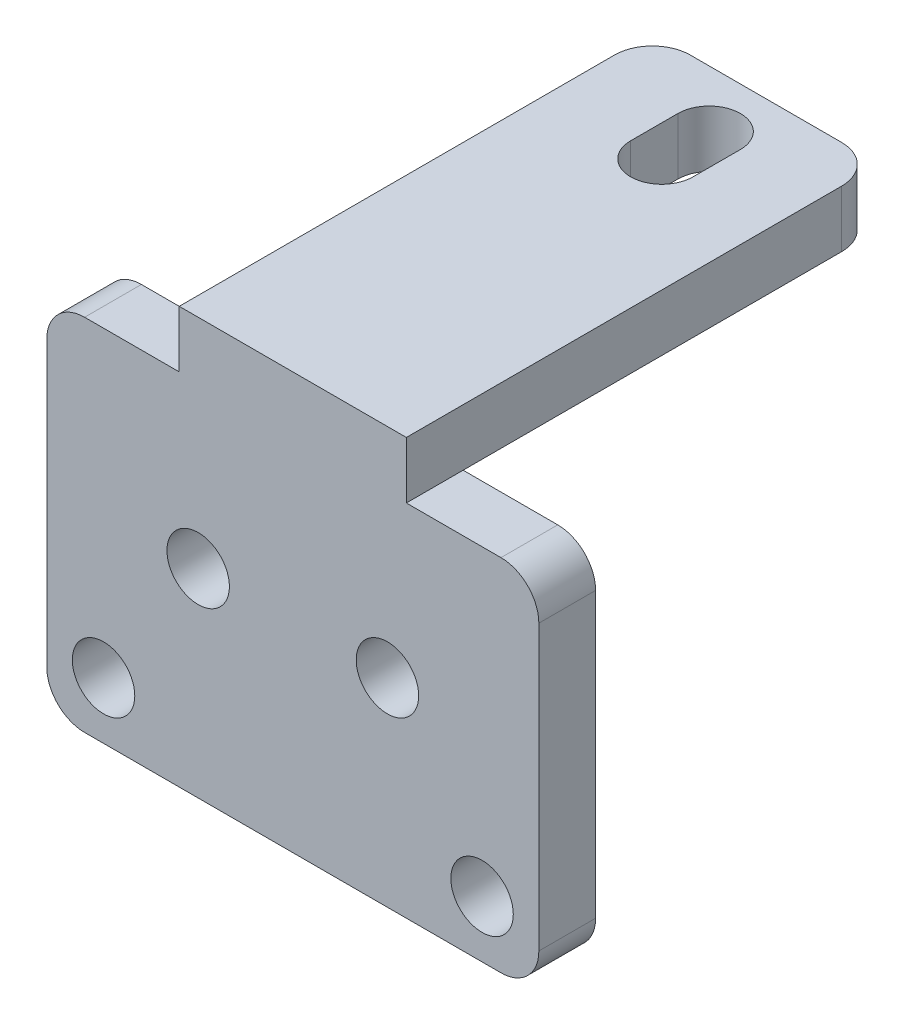
ISO-10303-21;
HEADER;
FILE_DESCRIPTION(('STEP AP214'),'2;1');
FILE_NAME('part.step','',(''),(''),'','','');
FILE_SCHEMA(('AUTOMOTIVE_DESIGN { 1 0 10303 214 1 1 1 1 }'));
ENDSEC;
DATA;
#1=APPLICATION_CONTEXT('core data for automotive mechanical design processes');
#2=APPLICATION_PROTOCOL_DEFINITION('international standard','automotive_design',2000,#1);
#3=PRODUCT_CONTEXT('',#1,'mechanical');
#4=PRODUCT('Part','Part','',(#3));
#5=PRODUCT_RELATED_PRODUCT_CATEGORY('part','',(#4));
#6=PRODUCT_DEFINITION_FORMATION('','',#4);
#7=PRODUCT_DEFINITION_CONTEXT('part definition',#1,'design');
#8=PRODUCT_DEFINITION('design','',#6,#7);
#9=PRODUCT_DEFINITION_SHAPE('','',#8);
#10=(LENGTH_UNIT() NAMED_UNIT(*) SI_UNIT(.MILLI.,.METRE.));
#11=(NAMED_UNIT(*) PLANE_ANGLE_UNIT() SI_UNIT($,.RADIAN.));
#12=(NAMED_UNIT(*) SI_UNIT($,.STERADIAN.) SOLID_ANGLE_UNIT());
#13=UNCERTAINTY_MEASURE_WITH_UNIT(LENGTH_MEASURE(1.E-05),#10,'distance_accuracy_value','');
#14=(GEOMETRIC_REPRESENTATION_CONTEXT(3) GLOBAL_UNCERTAINTY_ASSIGNED_CONTEXT((#13)) GLOBAL_UNIT_ASSIGNED_CONTEXT((#10,
#11,#12)) REPRESENTATION_CONTEXT('',''));
#15=CARTESIAN_POINT('',(0.,0.,0.));
#16=DIRECTION('',(0.,0.,1.));
#17=DIRECTION('',(1.,0.,0.));
#18=AXIS2_PLACEMENT_3D('',#15,#16,#17);
#19=CARTESIAN_POINT('',(0.,19.,3.));
#20=DIRECTION('',(0.,1.,0.));
#21=DIRECTION('',(0.,0.,1.));
#22=AXIS2_PLACEMENT_3D('',#19,#20,#21);
#23=PLANE('',#22);
#24=DIRECTION('',(0.,0.,-1.));
#25=VECTOR('',#24,1.);
#26=CARTESIAN_POINT('',(6.,19.,3.));
#27=LINE('',#26,#25);
#28=CARTESIAN_POINT('',(6.,19.,3.));
#29=VERTEX_POINT('',#28);
#30=CARTESIAN_POINT('',(6.,19.,-20.));
#31=VERTEX_POINT('',#30);
#32=EDGE_CURVE('E269',#29,#31,#27,.T.);
#33=ORIENTED_EDGE('',*,*,#32,.T.);
#34=CARTESIAN_POINT('',(4.,19.,-20.));
#35=DIRECTION('',(0.,1.,0.));
#36=DIRECTION('',(0.,0.,1.));
#37=AXIS2_PLACEMENT_3D('',#34,#35,#36);
#38=CIRCLE('',#37,2.);
#39=CARTESIAN_POINT('',(4.,19.,-22.));
#40=VERTEX_POINT('',#39);
#41=EDGE_CURVE('E298',#31,#40,#38,.T.);
#42=ORIENTED_EDGE('',*,*,#41,.T.);
#43=DIRECTION('',(1.,0.,0.));
#44=VECTOR('',#43,1.);
#45=CARTESIAN_POINT('',(0.,19.,-22.));
#46=LINE('',#45,#44);
#47=CARTESIAN_POINT('',(-4.,19.,-22.));
#48=VERTEX_POINT('',#47);
#49=EDGE_CURVE('E202',#48,#40,#46,.T.);
#50=ORIENTED_EDGE('',*,*,#49,.F.);
#51=CARTESIAN_POINT('',(-4.,19.,-20.));
#52=DIRECTION('',(0.,1.,0.));
#53=DIRECTION('',(0.,0.,1.));
#54=AXIS2_PLACEMENT_3D('',#51,#52,#53);
#55=CIRCLE('',#54,2.);
#56=CARTESIAN_POINT('',(-6.,19.,-20.));
#57=VERTEX_POINT('',#56);
#58=EDGE_CURVE('E296',#48,#57,#55,.T.);
#59=ORIENTED_EDGE('',*,*,#58,.T.);
#60=DIRECTION('',(0.,0.,-1.));
#61=VECTOR('',#60,1.);
#62=CARTESIAN_POINT('',(-6.,19.,3.));
#63=LINE('',#62,#61);
#64=CARTESIAN_POINT('',(-6.,19.,3.));
#65=VERTEX_POINT('',#64);
#66=EDGE_CURVE('E266',#65,#57,#63,.T.);
#67=ORIENTED_EDGE('',*,*,#66,.F.);
#68=DIRECTION('',(1.,0.,0.));
#69=VECTOR('',#68,1.);
#70=CARTESIAN_POINT('',(0.,19.,3.));
#71=LINE('',#70,#69);
#72=EDGE_CURVE('E232',#65,#29,#71,.T.);
#73=ORIENTED_EDGE('',*,*,#72,.T.);
#74=EDGE_LOOP('',(#33,#42,#50,#59,#67,#73));
#75=FACE_BOUND('',#74,.T.);
#76=DIRECTION('',(0.,0.,1.));
#77=VECTOR('',#76,1.);
#78=CARTESIAN_POINT('',(-1.65,19.,3.));
#79=LINE('',#78,#77);
#80=CARTESIAN_POINT('',(-1.65,19.,-19.));
#81=VERTEX_POINT('',#80);
#82=CARTESIAN_POINT('',(-1.65,19.,-16.5));
#83=VERTEX_POINT('',#82);
#84=EDGE_CURVE('E184',#81,#83,#79,.T.);
#85=ORIENTED_EDGE('',*,*,#84,.F.);
#86=CARTESIAN_POINT('',(0.,19.,-19.));
#87=DIRECTION('',(0.,1.,0.));
#88=DIRECTION('',(0.,0.,1.));
#89=AXIS2_PLACEMENT_3D('',#86,#87,#88);
#90=CIRCLE('',#89,1.65);
#91=CARTESIAN_POINT('',(1.65,19.,-19.));
#92=VERTEX_POINT('',#91);
#93=EDGE_CURVE('E167',#81,#92,#90,.F.);
#94=ORIENTED_EDGE('',*,*,#93,.T.);
#95=DIRECTION('',(0.,0.,1.));
#96=VECTOR('',#95,1.);
#97=CARTESIAN_POINT('',(1.65,19.,3.));
#98=LINE('',#97,#96);
#99=CARTESIAN_POINT('',(1.65,19.,-16.5));
#100=VERTEX_POINT('',#99);
#101=EDGE_CURVE('E178',#92,#100,#98,.T.);
#102=ORIENTED_EDGE('',*,*,#101,.T.);
#103=CARTESIAN_POINT('',(0.,19.,-16.5));
#104=DIRECTION('',(0.,1.,0.));
#105=DIRECTION('',(0.,0.,1.));
#106=AXIS2_PLACEMENT_3D('',#103,#104,#105);
#107=CIRCLE('',#106,1.65);
#108=EDGE_CURVE('E191',#100,#83,#107,.F.);
#109=ORIENTED_EDGE('',*,*,#108,.T.);
#110=EDGE_LOOP('',(#85,#94,#102,#109));
#111=FACE_BOUND('',#110,.T.);
#112=ADVANCED_FACE('F37',(#75,#111),#23,.T.);
#113=CARTESIAN_POINT('',(0.,16.,-22.));
#114=DIRECTION('',(0.,-1.,0.));
#115=DIRECTION('',(1.,0.,0.));
#116=AXIS2_PLACEMENT_3D('',#113,#114,#115);
#117=PLANE('',#116);
#118=DIRECTION('',(1.,0.,0.));
#119=VECTOR('',#118,1.);
#120=CARTESIAN_POINT('',(0.,16.,-22.));
#121=LINE('',#120,#119);
#122=CARTESIAN_POINT('',(-4.,16.,-22.));
#123=VERTEX_POINT('',#122);
#124=CARTESIAN_POINT('',(4.,16.,-22.));
#125=VERTEX_POINT('',#124);
#126=EDGE_CURVE('E195',#123,#125,#121,.T.);
#127=ORIENTED_EDGE('',*,*,#126,.T.);
#128=CARTESIAN_POINT('',(4.,16.,-20.));
#129=DIRECTION('',(0.,-1.,0.));
#130=DIRECTION('',(1.,0.,0.));
#131=AXIS2_PLACEMENT_3D('',#128,#129,#130);
#132=CIRCLE('',#131,2.);
#133=CARTESIAN_POINT('',(6.,16.,-20.));
#134=VERTEX_POINT('',#133);
#135=EDGE_CURVE('E292',#125,#134,#132,.T.);
#136=ORIENTED_EDGE('',*,*,#135,.T.);
#137=DIRECTION('',(0.,0.,1.));
#138=VECTOR('',#137,1.);
#139=CARTESIAN_POINT('',(6.,16.,-22.));
#140=LINE('',#139,#138);
#141=CARTESIAN_POINT('',(6.,16.,0.));
#142=VERTEX_POINT('',#141);
#143=EDGE_CURVE('E204',#134,#142,#140,.T.);
#144=ORIENTED_EDGE('',*,*,#143,.T.);
#145=DIRECTION('',(1.,0.,0.));
#146=VECTOR('',#145,1.);
#147=CARTESIAN_POINT('',(0.,16.,0.));
#148=LINE('',#147,#146);
#149=CARTESIAN_POINT('',(-6.,16.,0.));
#150=VERTEX_POINT('',#149);
#151=EDGE_CURVE('E192',#150,#142,#148,.T.);
#152=ORIENTED_EDGE('',*,*,#151,.F.);
#153=DIRECTION('',(0.,0.,1.));
#154=VECTOR('',#153,1.);
#155=CARTESIAN_POINT('',(-6.,16.,-22.));
#156=LINE('',#155,#154);
#157=CARTESIAN_POINT('',(-6.,16.,-20.));
#158=VERTEX_POINT('',#157);
#159=EDGE_CURVE('E208',#158,#150,#156,.T.);
#160=ORIENTED_EDGE('',*,*,#159,.F.);
#161=CARTESIAN_POINT('',(-4.,16.,-20.));
#162=DIRECTION('',(0.,-1.,0.));
#163=DIRECTION('',(1.,0.,0.));
#164=AXIS2_PLACEMENT_3D('',#161,#162,#163);
#165=CIRCLE('',#164,2.);
#166=EDGE_CURVE('E290',#158,#123,#165,.T.);
#167=ORIENTED_EDGE('',*,*,#166,.T.);
#168=EDGE_LOOP('',(#127,#136,#144,#152,#160,#167));
#169=FACE_BOUND('',#168,.T.);
#170=DIRECTION('',(0.,0.,-1.));
#171=VECTOR('',#170,1.);
#172=CARTESIAN_POINT('',(-1.65,16.,-22.));
#173=LINE('',#172,#171);
#174=CARTESIAN_POINT('',(-1.65,16.,-16.5));
#175=VERTEX_POINT('',#174);
#176=CARTESIAN_POINT('',(-1.65,16.,-19.));
#177=VERTEX_POINT('',#176);
#178=EDGE_CURVE('E187',#175,#177,#173,.T.);
#179=ORIENTED_EDGE('',*,*,#178,.F.);
#180=CARTESIAN_POINT('',(0.,16.,-16.5));
#181=DIRECTION('',(0.,-1.,0.));
#182=DIRECTION('',(1.,0.,0.));
#183=AXIS2_PLACEMENT_3D('',#180,#181,#182);
#184=CIRCLE('',#183,1.65);
#185=CARTESIAN_POINT('',(1.65,16.,-16.5));
#186=VERTEX_POINT('',#185);
#187=EDGE_CURVE('E280',#175,#186,#184,.F.);
#188=ORIENTED_EDGE('',*,*,#187,.T.);
#189=DIRECTION('',(0.,0.,-1.));
#190=VECTOR('',#189,1.);
#191=CARTESIAN_POINT('',(1.65,16.,-22.));
#192=LINE('',#191,#190);
#193=CARTESIAN_POINT('',(1.65,16.,-19.));
#194=VERTEX_POINT('',#193);
#195=EDGE_CURVE('E277',#186,#194,#192,.T.);
#196=ORIENTED_EDGE('',*,*,#195,.T.);
#197=CARTESIAN_POINT('',(0.,16.,-19.));
#198=DIRECTION('',(0.,-1.,0.));
#199=DIRECTION('',(1.,0.,0.));
#200=AXIS2_PLACEMENT_3D('',#197,#198,#199);
#201=CIRCLE('',#200,1.65);
#202=EDGE_CURVE('E275',#194,#177,#201,.F.);
#203=ORIENTED_EDGE('',*,*,#202,.T.);
#204=EDGE_LOOP('',(#179,#188,#196,#203));
#205=FACE_BOUND('',#204,.T.);
#206=ADVANCED_FACE('F393',(#169,#205),#117,.T.);
#207=CARTESIAN_POINT('',(13.,0.,3.));
#208=DIRECTION('',(1.,0.,0.));
#209=DIRECTION('',(0.,1.,0.));
#210=AXIS2_PLACEMENT_3D('',#207,#208,#209);
#211=PLANE('',#210);
#212=DIRECTION('',(0.,-1.,0.));
#213=VECTOR('',#212,1.);
#214=CARTESIAN_POINT('',(13.,0.,0.));
#215=LINE('',#214,#213);
#216=CARTESIAN_POINT('',(13.,14.,0.));
#217=VERTEX_POINT('',#216);
#218=CARTESIAN_POINT('',(13.,-0.999999999999985,0.));
#219=VERTEX_POINT('',#218);
#220=EDGE_CURVE('E254',#217,#219,#215,.T.);
#221=ORIENTED_EDGE('',*,*,#220,.F.);
#222=DIRECTION('',(0.,0.,-1.));
#223=VECTOR('',#222,1.);
#224=CARTESIAN_POINT('',(13.,14.,3.));
#225=LINE('',#224,#223);
#226=CARTESIAN_POINT('',(13.,14.,3.));
#227=VERTEX_POINT('',#226);
#228=EDGE_CURVE('E330',#217,#227,#225,.F.);
#229=ORIENTED_EDGE('',*,*,#228,.T.);
#230=DIRECTION('',(0.,-1.,0.));
#231=VECTOR('',#230,1.);
#232=CARTESIAN_POINT('',(13.,0.,3.));
#233=LINE('',#232,#231);
#234=CARTESIAN_POINT('',(13.,-0.999999999999985,3.));
#235=VERTEX_POINT('',#234);
#236=EDGE_CURVE('E224',#227,#235,#233,.T.);
#237=ORIENTED_EDGE('',*,*,#236,.T.);
#238=DIRECTION('',(0.,0.,-1.));
#239=VECTOR('',#238,1.);
#240=CARTESIAN_POINT('',(13.,-0.999999999999985,0.));
#241=LINE('',#240,#239);
#242=EDGE_CURVE('E327',#235,#219,#241,.T.);
#243=ORIENTED_EDGE('',*,*,#242,.T.);
#244=EDGE_LOOP('',(#221,#229,#237,#243));
#245=FACE_BOUND('',#244,.T.);
#246=ADVANCED_FACE('F345',(#245),#211,.T.);
#247=CARTESIAN_POINT('',(0.,16.,3.));
#248=DIRECTION('',(0.,-1.,0.));
#249=DIRECTION('',(1.,0.,0.));
#250=AXIS2_PLACEMENT_3D('',#247,#248,#249);
#251=PLANE('',#250);
#252=DIRECTION('',(-1.,0.,0.));
#253=VECTOR('',#252,1.);
#254=CARTESIAN_POINT('',(0.,16.,3.));
#255=LINE('',#254,#253);
#256=CARTESIAN_POINT('',(11.,16.,3.));
#257=VERTEX_POINT('',#256);
#258=CARTESIAN_POINT('',(6.,16.,3.));
#259=VERTEX_POINT('',#258);
#260=EDGE_CURVE('E227',#257,#259,#255,.T.);
#261=ORIENTED_EDGE('',*,*,#260,.F.);
#262=DIRECTION('',(0.,0.,-1.));
#263=VECTOR('',#262,1.);
#264=CARTESIAN_POINT('',(11.,16.,0.));
#265=LINE('',#264,#263);
#266=CARTESIAN_POINT('',(11.,16.,0.));
#267=VERTEX_POINT('',#266);
#268=EDGE_CURVE('E324',#257,#267,#265,.T.);
#269=ORIENTED_EDGE('',*,*,#268,.T.);
#270=DIRECTION('',(-1.,0.,0.));
#271=VECTOR('',#270,1.);
#272=CARTESIAN_POINT('',(0.,16.,0.));
#273=LINE('',#272,#271);
#274=EDGE_CURVE('E257',#267,#142,#273,.T.);
#275=ORIENTED_EDGE('',*,*,#274,.T.);
#276=DIRECTION('',(0.,0.,-1.));
#277=VECTOR('',#276,1.);
#278=CARTESIAN_POINT('',(6.,16.,3.));
#279=LINE('',#278,#277);
#280=EDGE_CURVE('E272',#259,#142,#279,.T.);
#281=ORIENTED_EDGE('',*,*,#280,.F.);
#282=EDGE_LOOP('',(#261,#269,#275,#281));
#283=FACE_BOUND('',#282,.T.);
#284=ADVANCED_FACE('F357',(#283),#251,.F.);
#285=CARTESIAN_POINT('',(6.,0.,3.));
#286=DIRECTION('',(-1.,0.,0.));
#287=DIRECTION('',(0.,0.,1.));
#288=AXIS2_PLACEMENT_3D('',#285,#286,#287);
#289=PLANE('',#288);
#290=ORIENTED_EDGE('',*,*,#143,.F.);
#291=DIRECTION('',(0.,-1.,0.));
#292=VECTOR('',#291,1.);
#293=CARTESIAN_POINT('',(6.,19.,-20.));
#294=LINE('',#293,#292);
#295=EDGE_CURVE('E294',#134,#31,#294,.F.);
#296=ORIENTED_EDGE('',*,*,#295,.T.);
#297=ORIENTED_EDGE('',*,*,#32,.F.);
#298=DIRECTION('',(0.,1.,0.));
#299=VECTOR('',#298,1.);
#300=CARTESIAN_POINT('',(6.,0.,3.));
#301=LINE('',#300,#299);
#302=EDGE_CURVE('E229',#259,#29,#301,.T.);
#303=ORIENTED_EDGE('',*,*,#302,.F.);
#304=ORIENTED_EDGE('',*,*,#280,.T.);
#305=EDGE_LOOP('',(#290,#296,#297,#303,#304));
#306=FACE_BOUND('',#305,.T.);
#307=ADVANCED_FACE('F367',(#306),#289,.F.);
#308=CARTESIAN_POINT('',(-6.,0.,3.));
#309=DIRECTION('',(-1.,0.,0.));
#310=DIRECTION('',(0.,0.,1.));
#311=AXIS2_PLACEMENT_3D('',#308,#309,#310);
#312=PLANE('',#311);
#313=ORIENTED_EDGE('',*,*,#66,.T.);
#314=DIRECTION('',(0.,1.,0.));
#315=VECTOR('',#314,1.);
#316=CARTESIAN_POINT('',(-6.,0.,-20.));
#317=LINE('',#316,#315);
#318=EDGE_CURVE('E300',#57,#158,#317,.F.);
#319=ORIENTED_EDGE('',*,*,#318,.T.);
#320=ORIENTED_EDGE('',*,*,#159,.T.);
#321=DIRECTION('',(0.,0.,-1.));
#322=VECTOR('',#321,1.);
#323=CARTESIAN_POINT('',(-6.,16.,3.));
#324=LINE('',#323,#322);
#325=CARTESIAN_POINT('',(-6.,16.,3.));
#326=VERTEX_POINT('',#325);
#327=EDGE_CURVE('E242',#326,#150,#324,.T.);
#328=ORIENTED_EDGE('',*,*,#327,.F.);
#329=DIRECTION('',(0.,1.,0.));
#330=VECTOR('',#329,1.);
#331=CARTESIAN_POINT('',(-6.,0.,3.));
#332=LINE('',#331,#330);
#333=EDGE_CURVE('E235',#326,#65,#332,.T.);
#334=ORIENTED_EDGE('',*,*,#333,.T.);
#335=EDGE_LOOP('',(#313,#319,#320,#328,#334));
#336=FACE_BOUND('',#335,.T.);
#337=ADVANCED_FACE('F374',(#336),#312,.T.);
#338=CARTESIAN_POINT('',(-11.,16.,0.));
#339=VERTEX_POINT('',#338);
#340=EDGE_CURVE('E259',#150,#339,#273,.T.);
#341=ORIENTED_EDGE('',*,*,#340,.T.);
#342=DIRECTION('',(0.,0.,-1.));
#343=VECTOR('',#342,1.);
#344=CARTESIAN_POINT('',(-11.,16.,3.));
#345=LINE('',#344,#343);
#346=CARTESIAN_POINT('',(-11.,16.,3.));
#347=VERTEX_POINT('',#346);
#348=EDGE_CURVE('E315',#339,#347,#345,.F.);
#349=ORIENTED_EDGE('',*,*,#348,.T.);
#350=EDGE_CURVE('E230',#326,#347,#255,.T.);
#351=ORIENTED_EDGE('',*,*,#350,.F.);
#352=ORIENTED_EDGE('',*,*,#327,.T.);
#353=EDGE_LOOP('',(#341,#349,#351,#352));
#354=FACE_BOUND('',#353,.T.);
#355=ADVANCED_FACE('F378',(#354),#251,.F.);
#356=CARTESIAN_POINT('',(-13.,0.,3.));
#357=DIRECTION('',(1.,0.,0.));
#358=DIRECTION('',(0.,1.,0.));
#359=AXIS2_PLACEMENT_3D('',#356,#357,#358);
#360=PLANE('',#359);
#361=DIRECTION('',(0.,-1.,0.));
#362=VECTOR('',#361,1.);
#363=CARTESIAN_POINT('',(-13.,0.,3.));
#364=LINE('',#363,#362);
#365=CARTESIAN_POINT('',(-13.,14.,3.));
#366=VERTEX_POINT('',#365);
#367=CARTESIAN_POINT('',(-13.,-0.999999999999999,3.));
#368=VERTEX_POINT('',#367);
#369=EDGE_CURVE('E238',#366,#368,#364,.T.);
#370=ORIENTED_EDGE('',*,*,#369,.F.);
#371=DIRECTION('',(0.,0.,-1.));
#372=VECTOR('',#371,1.);
#373=CARTESIAN_POINT('',(-13.,14.,3.));
#374=LINE('',#373,#372);
#375=CARTESIAN_POINT('',(-13.,14.,0.));
#376=VERTEX_POINT('',#375);
#377=EDGE_CURVE('E304',#366,#376,#374,.T.);
#378=ORIENTED_EDGE('',*,*,#377,.T.);
#379=DIRECTION('',(0.,-1.,0.));
#380=VECTOR('',#379,1.);
#381=CARTESIAN_POINT('',(-13.,0.,0.));
#382=LINE('',#381,#380);
#383=CARTESIAN_POINT('',(-13.,-0.999999999999999,0.));
#384=VERTEX_POINT('',#383);
#385=EDGE_CURVE('E260',#376,#384,#382,.T.);
#386=ORIENTED_EDGE('',*,*,#385,.T.);
#387=DIRECTION('',(0.,0.,-1.));
#388=VECTOR('',#387,1.);
#389=CARTESIAN_POINT('',(-13.,-0.999999999999999,3.));
#390=LINE('',#389,#388);
#391=EDGE_CURVE('E302',#384,#368,#390,.F.);
#392=ORIENTED_EDGE('',*,*,#391,.T.);
#393=EDGE_LOOP('',(#370,#378,#386,#392));
#394=FACE_BOUND('',#393,.T.);
#395=ADVANCED_FACE('F386',(#394),#360,.F.);
#396=CARTESIAN_POINT('',(-5.00000000000002,7.49999999999996,3.));
#397=DIRECTION('',(0.,0.,-1.));
#398=DIRECTION('',(-1.,0.,0.));
#399=AXIS2_PLACEMENT_3D('',#396,#397,#398);
#400=CYLINDRICAL_SURFACE('',#399,1.65);
#401=CARTESIAN_POINT('',(-5.00000000000002,7.49999999999996,3.));
#402=DIRECTION('',(0.,0.,1.));
#403=DIRECTION('',(1.,0.,0.));
#404=AXIS2_PLACEMENT_3D('',#401,#402,#403);
#405=CIRCLE('',#404,1.65);
#406=CARTESIAN_POINT('',(-3.35000000000002,7.49999999999996,3.));
#407=VERTEX_POINT('',#406);
#408=EDGE_CURVE('E221',#407,#407,#405,.T.);
#409=ORIENTED_EDGE('',*,*,#408,.T.);
#410=EDGE_LOOP('',(#409));
#411=FACE_BOUND('',#410,.T.);
#412=CARTESIAN_POINT('',(-5.00000000000002,7.49999999999996,0.));
#413=DIRECTION('',(0.,0.,1.));
#414=DIRECTION('',(1.,0.,0.));
#415=AXIS2_PLACEMENT_3D('',#412,#413,#414);
#416=CIRCLE('',#415,1.65);
#417=CARTESIAN_POINT('',(-3.35000000000002,7.49999999999996,0.));
#418=VERTEX_POINT('',#417);
#419=EDGE_CURVE('E251',#418,#418,#416,.T.);
#420=ORIENTED_EDGE('',*,*,#419,.F.);
#421=EDGE_LOOP('',(#420));
#422=FACE_BOUND('',#421,.T.);
#423=ADVANCED_FACE('F406',(#411,#422),#400,.F.);
#424=CARTESIAN_POINT('',(4.99999999999997,7.5,3.));
#425=DIRECTION('',(0.,0.,-1.));
#426=DIRECTION('',(-1.,0.,0.));
#427=AXIS2_PLACEMENT_3D('',#424,#425,#426);
#428=CYLINDRICAL_SURFACE('',#427,1.65);
#429=CARTESIAN_POINT('',(4.99999999999997,7.5,3.));
#430=DIRECTION('',(0.,0.,1.));
#431=DIRECTION('',(1.,0.,0.));
#432=AXIS2_PLACEMENT_3D('',#429,#430,#431);
#433=CIRCLE('',#432,1.65);
#434=CARTESIAN_POINT('',(6.64999999999997,7.5,3.));
#435=VERTEX_POINT('',#434);
#436=EDGE_CURVE('E218',#435,#435,#433,.T.);
#437=ORIENTED_EDGE('',*,*,#436,.T.);
#438=EDGE_LOOP('',(#437));
#439=FACE_BOUND('',#438,.T.);
#440=CARTESIAN_POINT('',(4.99999999999997,7.5,0.));
#441=DIRECTION('',(0.,0.,1.));
#442=DIRECTION('',(1.,0.,0.));
#443=AXIS2_PLACEMENT_3D('',#440,#441,#442);
#444=CIRCLE('',#443,1.65);
#445=CARTESIAN_POINT('',(6.64999999999997,7.5,0.));
#446=VERTEX_POINT('',#445);
#447=EDGE_CURVE('E248',#446,#446,#444,.T.);
#448=ORIENTED_EDGE('',*,*,#447,.F.);
#449=EDGE_LOOP('',(#448));
#450=FACE_BOUND('',#449,.T.);
#451=ADVANCED_FACE('F409',(#439,#450),#428,.F.);
#452=CARTESIAN_POINT('',(-10.,0.,3.));
#453=DIRECTION('',(0.,0.,-1.));
#454=DIRECTION('',(-1.,0.,0.));
#455=AXIS2_PLACEMENT_3D('',#452,#453,#454);
#456=CYLINDRICAL_SURFACE('',#455,1.65);
#457=CARTESIAN_POINT('',(-10.,0.,3.));
#458=DIRECTION('',(0.,0.,1.));
#459=DIRECTION('',(1.,0.,0.));
#460=AXIS2_PLACEMENT_3D('',#457,#458,#459);
#461=CIRCLE('',#460,1.65);
#462=CARTESIAN_POINT('',(-8.35000000000001,0.,3.));
#463=VERTEX_POINT('',#462);
#464=EDGE_CURVE('E214',#463,#463,#461,.T.);
#465=ORIENTED_EDGE('',*,*,#464,.T.);
#466=EDGE_LOOP('',(#465));
#467=FACE_BOUND('',#466,.T.);
#468=CARTESIAN_POINT('',(-10.,0.,0.));
#469=DIRECTION('',(0.,0.,1.));
#470=DIRECTION('',(1.,0.,0.));
#471=AXIS2_PLACEMENT_3D('',#468,#469,#470);
#472=CIRCLE('',#471,1.65);
#473=CARTESIAN_POINT('',(-8.35000000000001,0.,0.));
#474=VERTEX_POINT('',#473);
#475=EDGE_CURVE('E245',#474,#474,#472,.T.);
#476=ORIENTED_EDGE('',*,*,#475,.F.);
#477=EDGE_LOOP('',(#476));
#478=FACE_BOUND('',#477,.T.);
#479=ADVANCED_FACE('F413',(#467,#478),#456,.F.);
#480=CARTESIAN_POINT('',(9.99999999999998,0.,3.));
#481=DIRECTION('',(0.,0.,-1.));
#482=DIRECTION('',(-1.,0.,0.));
#483=AXIS2_PLACEMENT_3D('',#480,#481,#482);
#484=CYLINDRICAL_SURFACE('',#483,1.65);
#485=CARTESIAN_POINT('',(9.99999999999998,0.,3.));
#486=DIRECTION('',(0.,0.,1.));
#487=DIRECTION('',(1.,0.,0.));
#488=AXIS2_PLACEMENT_3D('',#485,#486,#487);
#489=CIRCLE('',#488,1.65);
#490=CARTESIAN_POINT('',(11.65,0.,3.));
#491=VERTEX_POINT('',#490);
#492=EDGE_CURVE('E211',#491,#491,#489,.T.);
#493=ORIENTED_EDGE('',*,*,#492,.T.);
#494=EDGE_LOOP('',(#493));
#495=FACE_BOUND('',#494,.T.);
#496=CARTESIAN_POINT('',(9.99999999999998,0.,0.));
#497=DIRECTION('',(0.,0.,1.));
#498=DIRECTION('',(1.,0.,0.));
#499=AXIS2_PLACEMENT_3D('',#496,#497,#498);
#500=CIRCLE('',#499,1.65);
#501=CARTESIAN_POINT('',(11.65,0.,0.));
#502=VERTEX_POINT('',#501);
#503=EDGE_CURVE('E210',#502,#502,#500,.T.);
#504=ORIENTED_EDGE('',*,*,#503,.F.);
#505=EDGE_LOOP('',(#504));
#506=FACE_BOUND('',#505,.T.);
#507=ADVANCED_FACE('F417',(#495,#506),#484,.F.);
#508=CARTESIAN_POINT('',(0.,-2.99999999999999,3.));
#509=DIRECTION('',(0.,1.,0.));
#510=DIRECTION('',(-1.,0.,0.));
#511=AXIS2_PLACEMENT_3D('',#508,#509,#510);
#512=PLANE('',#511);
#513=DIRECTION('',(1.,0.,0.));
#514=VECTOR('',#513,1.);
#515=CARTESIAN_POINT('',(0.,-2.99999999999999,0.));
#516=LINE('',#515,#514);
#517=CARTESIAN_POINT('',(-11.,-3.,0.));
#518=VERTEX_POINT('',#517);
#519=CARTESIAN_POINT('',(11.,-2.99999999999999,0.));
#520=VERTEX_POINT('',#519);
#521=EDGE_CURVE('E215',#518,#520,#516,.T.);
#522=ORIENTED_EDGE('',*,*,#521,.T.);
#523=DIRECTION('',(0.,0.,-1.));
#524=VECTOR('',#523,1.);
#525=CARTESIAN_POINT('',(11.,-2.99999999999999,3.));
#526=LINE('',#525,#524);
#527=CARTESIAN_POINT('',(11.,-2.99999999999999,3.));
#528=VERTEX_POINT('',#527);
#529=EDGE_CURVE('E11',#520,#528,#526,.F.);
#530=ORIENTED_EDGE('',*,*,#529,.T.);
#531=DIRECTION('',(1.,0.,0.));
#532=VECTOR('',#531,1.);
#533=CARTESIAN_POINT('',(0.,-2.99999999999999,3.));
#534=LINE('',#533,#532);
#535=CARTESIAN_POINT('',(-11.,-3.,3.));
#536=VERTEX_POINT('',#535);
#537=EDGE_CURVE('E240',#536,#528,#534,.T.);
#538=ORIENTED_EDGE('',*,*,#537,.F.);
#539=DIRECTION('',(0.,0.,-1.));
#540=VECTOR('',#539,1.);
#541=CARTESIAN_POINT('',(-11.,-3.,3.));
#542=LINE('',#541,#540);
#543=EDGE_CURVE('E45',#536,#518,#542,.T.);
#544=ORIENTED_EDGE('',*,*,#543,.T.);
#545=EDGE_LOOP('',(#522,#530,#538,#544));
#546=FACE_BOUND('',#545,.T.);
#547=ADVANCED_FACE('F334',(#546),#512,.F.);
#548=CARTESIAN_POINT('',(0.,0.,3.));
#549=DIRECTION('',(0.,0.,1.));
#550=DIRECTION('',(1.,0.,0.));
#551=AXIS2_PLACEMENT_3D('',#548,#549,#550);
#552=PLANE('',#551);
#553=ORIENTED_EDGE('',*,*,#492,.F.);
#554=EDGE_LOOP('',(#553));
#555=FACE_BOUND('',#554,.T.);
#556=ORIENTED_EDGE('',*,*,#464,.F.);
#557=EDGE_LOOP('',(#556));
#558=FACE_BOUND('',#557,.T.);
#559=ORIENTED_EDGE('',*,*,#436,.F.);
#560=EDGE_LOOP('',(#559));
#561=FACE_BOUND('',#560,.T.);
#562=ORIENTED_EDGE('',*,*,#408,.F.);
#563=EDGE_LOOP('',(#562));
#564=FACE_BOUND('',#563,.T.);
#565=ORIENTED_EDGE('',*,*,#350,.T.);
#566=CARTESIAN_POINT('',(-11.,14.,3.));
#567=DIRECTION('',(0.,0.,1.));
#568=DIRECTION('',(1.,0.,0.));
#569=AXIS2_PLACEMENT_3D('',#566,#567,#568);
#570=CIRCLE('',#569,2.);
#571=EDGE_CURVE('E322',#347,#366,#570,.T.);
#572=ORIENTED_EDGE('',*,*,#571,.T.);
#573=ORIENTED_EDGE('',*,*,#369,.T.);
#574=CARTESIAN_POINT('',(-11.,-0.999999999999999,3.));
#575=DIRECTION('',(0.,0.,1.));
#576=DIRECTION('',(1.,0.,0.));
#577=AXIS2_PLACEMENT_3D('',#574,#575,#576);
#578=CIRCLE('',#577,2.);
#579=EDGE_CURVE('E57',#368,#536,#578,.T.);
#580=ORIENTED_EDGE('',*,*,#579,.T.);
#581=ORIENTED_EDGE('',*,*,#537,.T.);
#582=CARTESIAN_POINT('',(11.,-0.999999999999986,3.));
#583=DIRECTION('',(0.,0.,1.));
#584=DIRECTION('',(1.,0.,0.));
#585=AXIS2_PLACEMENT_3D('',#582,#583,#584);
#586=CIRCLE('',#585,2.);
#587=EDGE_CURVE('E318',#528,#235,#586,.T.);
#588=ORIENTED_EDGE('',*,*,#587,.T.);
#589=ORIENTED_EDGE('',*,*,#236,.F.);
#590=CARTESIAN_POINT('',(11.,14.,3.));
#591=DIRECTION('',(0.,0.,1.));
#592=DIRECTION('',(1.,0.,0.));
#593=AXIS2_PLACEMENT_3D('',#590,#591,#592);
#594=CIRCLE('',#593,2.);
#595=EDGE_CURVE('E320',#227,#257,#594,.T.);
#596=ORIENTED_EDGE('',*,*,#595,.T.);
#597=ORIENTED_EDGE('',*,*,#260,.T.);
#598=ORIENTED_EDGE('',*,*,#302,.T.);
#599=ORIENTED_EDGE('',*,*,#72,.F.);
#600=ORIENTED_EDGE('',*,*,#333,.F.);
#601=EDGE_LOOP('',(#565,#572,#573,#580,#581,#588,#589,#596,#597,#598,#599,#600));
#602=FACE_BOUND('',#601,.T.);
#603=ADVANCED_FACE('F350',(#555,#558,#561,#564,#602),#552,.T.);
#604=CARTESIAN_POINT('',(0.,0.,0.));
#605=DIRECTION('',(0.,0.,1.));
#606=DIRECTION('',(1.,0.,0.));
#607=AXIS2_PLACEMENT_3D('',#604,#605,#606);
#608=PLANE('',#607);
#609=ORIENTED_EDGE('',*,*,#503,.T.);
#610=EDGE_LOOP('',(#609));
#611=FACE_BOUND('',#610,.T.);
#612=ORIENTED_EDGE('',*,*,#475,.T.);
#613=EDGE_LOOP('',(#612));
#614=FACE_BOUND('',#613,.T.);
#615=ORIENTED_EDGE('',*,*,#447,.T.);
#616=EDGE_LOOP('',(#615));
#617=FACE_BOUND('',#616,.T.);
#618=ORIENTED_EDGE('',*,*,#419,.T.);
#619=EDGE_LOOP('',(#618));
#620=FACE_BOUND('',#619,.T.);
#621=ORIENTED_EDGE('',*,*,#385,.F.);
#622=CARTESIAN_POINT('',(-11.,14.,0.));
#623=DIRECTION('',(0.,0.,1.));
#624=DIRECTION('',(1.,0.,0.));
#625=AXIS2_PLACEMENT_3D('',#622,#623,#624);
#626=CIRCLE('',#625,2.);
#627=EDGE_CURVE('E313',#376,#339,#626,.F.);
#628=ORIENTED_EDGE('',*,*,#627,.T.);
#629=ORIENTED_EDGE('',*,*,#340,.F.);
#630=ORIENTED_EDGE('',*,*,#151,.T.);
#631=ORIENTED_EDGE('',*,*,#274,.F.);
#632=CARTESIAN_POINT('',(11.,14.,0.));
#633=DIRECTION('',(0.,0.,1.));
#634=DIRECTION('',(1.,0.,0.));
#635=AXIS2_PLACEMENT_3D('',#632,#633,#634);
#636=CIRCLE('',#635,2.);
#637=EDGE_CURVE('E311',#267,#217,#636,.F.);
#638=ORIENTED_EDGE('',*,*,#637,.T.);
#639=ORIENTED_EDGE('',*,*,#220,.T.);
#640=CARTESIAN_POINT('',(11.,-0.999999999999986,0.));
#641=DIRECTION('',(0.,0.,1.));
#642=DIRECTION('',(1.,0.,0.));
#643=AXIS2_PLACEMENT_3D('',#640,#641,#642);
#644=CIRCLE('',#643,2.);
#645=EDGE_CURVE('E309',#219,#520,#644,.F.);
#646=ORIENTED_EDGE('',*,*,#645,.T.);
#647=ORIENTED_EDGE('',*,*,#521,.F.);
#648=CARTESIAN_POINT('',(-11.,-0.999999999999999,0.));
#649=DIRECTION('',(0.,0.,1.));
#650=DIRECTION('',(1.,0.,0.));
#651=AXIS2_PLACEMENT_3D('',#648,#649,#650);
#652=CIRCLE('',#651,2.);
#653=EDGE_CURVE('E307',#518,#384,#652,.F.);
#654=ORIENTED_EDGE('',*,*,#653,.T.);
#655=EDGE_LOOP('',(#621,#628,#629,#630,#631,#638,#639,#646,#647,#654));
#656=FACE_BOUND('',#655,.T.);
#657=ADVANCED_FACE('F338',(#611,#614,#617,#620,#656),#608,.F.);
#658=CARTESIAN_POINT('',(0.,0.,-22.));
#659=DIRECTION('',(0.,0.,-1.));
#660=DIRECTION('',(-1.,0.,0.));
#661=AXIS2_PLACEMENT_3D('',#658,#659,#660);
#662=PLANE('',#661);
#663=ORIENTED_EDGE('',*,*,#49,.T.);
#664=DIRECTION('',(0.,-1.,0.));
#665=VECTOR('',#664,1.);
#666=CARTESIAN_POINT('',(4.,16.,-22.));
#667=LINE('',#666,#665);
#668=EDGE_CURVE('E287',#40,#125,#667,.T.);
#669=ORIENTED_EDGE('',*,*,#668,.T.);
#670=ORIENTED_EDGE('',*,*,#126,.F.);
#671=DIRECTION('',(0.,1.,0.));
#672=VECTOR('',#671,1.);
#673=CARTESIAN_POINT('',(-4.,0.,-22.));
#674=LINE('',#673,#672);
#675=EDGE_CURVE('E284',#123,#48,#674,.T.);
#676=ORIENTED_EDGE('',*,*,#675,.T.);
#677=EDGE_LOOP('',(#663,#669,#670,#676));
#678=FACE_BOUND('',#677,.T.);
#679=ADVANCED_FACE('F497',(#678),#662,.T.);
#680=CARTESIAN_POINT('',(-1.65,32.,0.));
#681=DIRECTION('',(-1.,0.,0.));
#682=DIRECTION('',(0.,0.,1.));
#683=AXIS2_PLACEMENT_3D('',#680,#681,#682);
#684=PLANE('',#683);
#685=ORIENTED_EDGE('',*,*,#84,.T.);
#686=DIRECTION('',(0.,-1.,0.));
#687=VECTOR('',#686,1.);
#688=CARTESIAN_POINT('',(-1.65,32.,-16.5));
#689=LINE('',#688,#687);
#690=EDGE_CURVE('E179',#83,#175,#689,.T.);
#691=ORIENTED_EDGE('',*,*,#690,.T.);
#692=ORIENTED_EDGE('',*,*,#178,.T.);
#693=DIRECTION('',(0.,-1.,0.));
#694=VECTOR('',#693,1.);
#695=CARTESIAN_POINT('',(-1.65,32.,-19.));
#696=LINE('',#695,#694);
#697=EDGE_CURVE('E170',#81,#177,#696,.T.);
#698=ORIENTED_EDGE('',*,*,#697,.F.);
#699=EDGE_LOOP('',(#685,#691,#692,#698));
#700=FACE_BOUND('',#699,.T.);
#701=ADVANCED_FACE('F182',(#700),#684,.F.);
#702=CARTESIAN_POINT('',(0.,32.,-16.5));
#703=DIRECTION('',(0.,-1.,0.));
#704=DIRECTION('',(0.,0.,-1.));
#705=AXIS2_PLACEMENT_3D('',#702,#703,#704);
#706=CYLINDRICAL_SURFACE('',#705,1.65);
#707=DIRECTION('',(0.,-1.,0.));
#708=VECTOR('',#707,1.);
#709=CARTESIAN_POINT('',(1.65,32.,-16.5));
#710=LINE('',#709,#708);
#711=EDGE_CURVE('E615',#100,#186,#710,.T.);
#712=ORIENTED_EDGE('',*,*,#711,.T.);
#713=ORIENTED_EDGE('',*,*,#187,.F.);
#714=ORIENTED_EDGE('',*,*,#690,.F.);
#715=ORIENTED_EDGE('',*,*,#108,.F.);
#716=EDGE_LOOP('',(#712,#713,#714,#715));
#717=FACE_BOUND('',#716,.T.);
#718=ADVANCED_FACE('F480',(#717),#706,.F.);
#719=CARTESIAN_POINT('',(1.65,32.,0.));
#720=DIRECTION('',(-1.,0.,0.));
#721=DIRECTION('',(0.,0.,1.));
#722=AXIS2_PLACEMENT_3D('',#719,#720,#721);
#723=PLANE('',#722);
#724=DIRECTION('',(0.,-1.,0.));
#725=VECTOR('',#724,1.);
#726=CARTESIAN_POINT('',(1.65,32.,-19.));
#727=LINE('',#726,#725);
#728=EDGE_CURVE('E173',#92,#194,#727,.T.);
#729=ORIENTED_EDGE('',*,*,#728,.T.);
#730=ORIENTED_EDGE('',*,*,#195,.F.);
#731=ORIENTED_EDGE('',*,*,#711,.F.);
#732=ORIENTED_EDGE('',*,*,#101,.F.);
#733=EDGE_LOOP('',(#729,#730,#731,#732));
#734=FACE_BOUND('',#733,.T.);
#735=ADVANCED_FACE('F472',(#734),#723,.T.);
#736=CARTESIAN_POINT('',(0.,32.,-19.));
#737=DIRECTION('',(0.,-1.,0.));
#738=DIRECTION('',(0.,0.,-1.));
#739=AXIS2_PLACEMENT_3D('',#736,#737,#738);
#740=CYLINDRICAL_SURFACE('',#739,1.65);
#741=ORIENTED_EDGE('',*,*,#697,.T.);
#742=ORIENTED_EDGE('',*,*,#202,.F.);
#743=ORIENTED_EDGE('',*,*,#728,.F.);
#744=ORIENTED_EDGE('',*,*,#93,.F.);
#745=EDGE_LOOP('',(#741,#742,#743,#744));
#746=FACE_BOUND('',#745,.T.);
#747=ADVANCED_FACE('F169',(#746),#740,.F.);
#748=CARTESIAN_POINT('',(4.,0.,-20.));
#749=DIRECTION('',(0.,1.,0.));
#750=DIRECTION('',(0.,0.,1.));
#751=AXIS2_PLACEMENT_3D('',#748,#749,#750);
#752=CYLINDRICAL_SURFACE('',#751,2.);
#753=ORIENTED_EDGE('',*,*,#41,.F.);
#754=ORIENTED_EDGE('',*,*,#295,.F.);
#755=ORIENTED_EDGE('',*,*,#135,.F.);
#756=ORIENTED_EDGE('',*,*,#668,.F.);
#757=EDGE_LOOP('',(#753,#754,#755,#756));
#758=FACE_BOUND('',#757,.T.);
#759=ADVANCED_FACE('F422',(#758),#752,.T.);
#760=CARTESIAN_POINT('',(-4.,0.,-20.));
#761=DIRECTION('',(0.,1.,0.));
#762=DIRECTION('',(0.,0.,1.));
#763=AXIS2_PLACEMENT_3D('',#760,#761,#762);
#764=CYLINDRICAL_SURFACE('',#763,2.);
#765=ORIENTED_EDGE('',*,*,#166,.F.);
#766=ORIENTED_EDGE('',*,*,#318,.F.);
#767=ORIENTED_EDGE('',*,*,#58,.F.);
#768=ORIENTED_EDGE('',*,*,#675,.F.);
#769=EDGE_LOOP('',(#765,#766,#767,#768));
#770=FACE_BOUND('',#769,.T.);
#771=ADVANCED_FACE('F425',(#770),#764,.T.);
#772=CARTESIAN_POINT('',(-11.,14.,3.));
#773=DIRECTION('',(0.,0.,-1.));
#774=DIRECTION('',(-1.,0.,0.));
#775=AXIS2_PLACEMENT_3D('',#772,#773,#774);
#776=CYLINDRICAL_SURFACE('',#775,2.);
#777=ORIENTED_EDGE('',*,*,#571,.F.);
#778=ORIENTED_EDGE('',*,*,#348,.F.);
#779=ORIENTED_EDGE('',*,*,#627,.F.);
#780=ORIENTED_EDGE('',*,*,#377,.F.);
#781=EDGE_LOOP('',(#777,#778,#779,#780));
#782=FACE_BOUND('',#781,.T.);
#783=ADVANCED_FACE('F384',(#782),#776,.T.);
#784=CARTESIAN_POINT('',(11.,14.,3.));
#785=DIRECTION('',(0.,0.,1.));
#786=DIRECTION('',(1.,0.,0.));
#787=AXIS2_PLACEMENT_3D('',#784,#785,#786);
#788=CYLINDRICAL_SURFACE('',#787,2.);
#789=ORIENTED_EDGE('',*,*,#595,.F.);
#790=ORIENTED_EDGE('',*,*,#228,.F.);
#791=ORIENTED_EDGE('',*,*,#637,.F.);
#792=ORIENTED_EDGE('',*,*,#268,.F.);
#793=EDGE_LOOP('',(#789,#790,#791,#792));
#794=FACE_BOUND('',#793,.T.);
#795=ADVANCED_FACE('F354',(#794),#788,.T.);
#796=CARTESIAN_POINT('',(11.,-0.999999999999986,3.));
#797=DIRECTION('',(0.,0.,1.));
#798=DIRECTION('',(1.,0.,0.));
#799=AXIS2_PLACEMENT_3D('',#796,#797,#798);
#800=CYLINDRICAL_SURFACE('',#799,2.);
#801=ORIENTED_EDGE('',*,*,#587,.F.);
#802=ORIENTED_EDGE('',*,*,#529,.F.);
#803=ORIENTED_EDGE('',*,*,#645,.F.);
#804=ORIENTED_EDGE('',*,*,#242,.F.);
#805=EDGE_LOOP('',(#801,#802,#803,#804));
#806=FACE_BOUND('',#805,.T.);
#807=ADVANCED_FACE('F343',(#806),#800,.T.);
#808=CARTESIAN_POINT('',(-11.,-0.999999999999999,3.));
#809=DIRECTION('',(0.,0.,-1.));
#810=DIRECTION('',(-1.,0.,0.));
#811=AXIS2_PLACEMENT_3D('',#808,#809,#810);
#812=CYLINDRICAL_SURFACE('',#811,2.);
#813=ORIENTED_EDGE('',*,*,#579,.F.);
#814=ORIENTED_EDGE('',*,*,#391,.F.);
#815=ORIENTED_EDGE('',*,*,#653,.F.);
#816=ORIENTED_EDGE('',*,*,#543,.F.);
#817=EDGE_LOOP('',(#813,#814,#815,#816));
#818=FACE_BOUND('',#817,.T.);
#819=ADVANCED_FACE('F39',(#818),#812,.T.);
#820=CLOSED_SHELL('',(#112,#206,#246,#284,#307,#337,#355,#395,#423,#451,#479,#507,#547,#603,
#657,#679,#701,#718,#735,#747,#759,#771,#783,#795,#807,#819));
#821=MANIFOLD_SOLID_BREP('B2',#820);
#822=ADVANCED_BREP_SHAPE_REPRESENTATION('',(#18,#821),#14);
#823=SHAPE_DEFINITION_REPRESENTATION(#9,#822);
ENDSEC;
END-ISO-10303-21;
